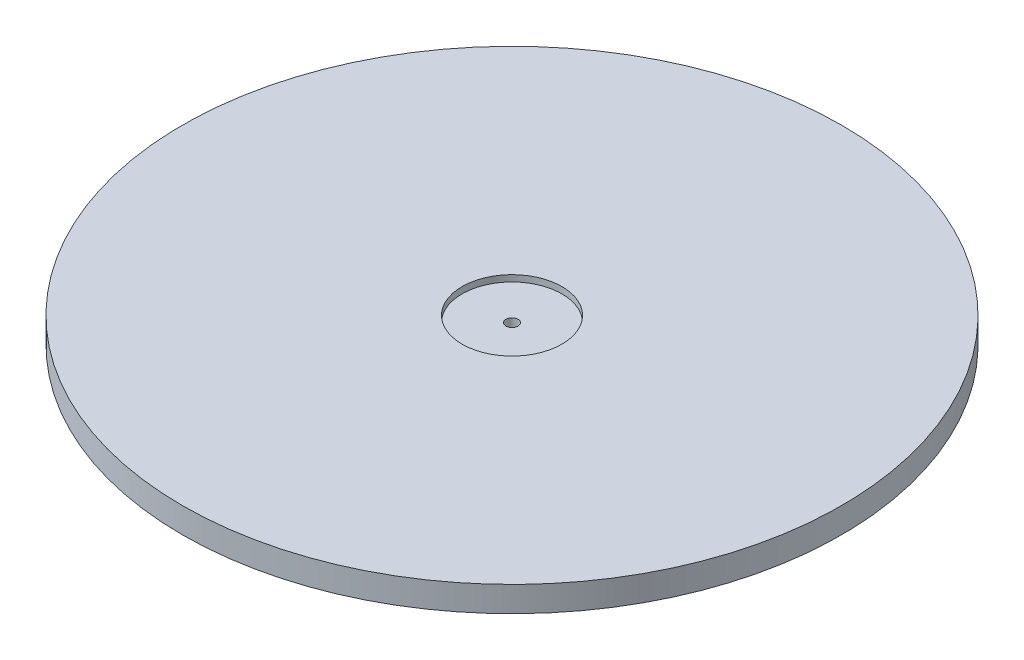
ISO-10303-21;
HEADER;
FILE_DESCRIPTION(('STEP AP214'),'2;1');
FILE_NAME('part.step','',(''),(''),'','','');
FILE_SCHEMA(('AUTOMOTIVE_DESIGN { 1 0 10303 214 1 1 1 1 }'));
ENDSEC;
DATA;
#1=APPLICATION_CONTEXT('core data for automotive mechanical design processes');
#2=APPLICATION_PROTOCOL_DEFINITION('international standard','automotive_design',2000,#1);
#3=PRODUCT_CONTEXT('',#1,'mechanical');
#4=PRODUCT('Part','Part','',(#3));
#5=PRODUCT_RELATED_PRODUCT_CATEGORY('part','',(#4));
#6=PRODUCT_DEFINITION_FORMATION('','',#4);
#7=PRODUCT_DEFINITION_CONTEXT('part definition',#1,'design');
#8=PRODUCT_DEFINITION('design','',#6,#7);
#9=PRODUCT_DEFINITION_SHAPE('','',#8);
#10=(LENGTH_UNIT() NAMED_UNIT(*) SI_UNIT(.MILLI.,.METRE.));
#11=(NAMED_UNIT(*) PLANE_ANGLE_UNIT() SI_UNIT($,.RADIAN.));
#12=(NAMED_UNIT(*) SI_UNIT($,.STERADIAN.) SOLID_ANGLE_UNIT());
#13=UNCERTAINTY_MEASURE_WITH_UNIT(LENGTH_MEASURE(1.E-05),#10,'distance_accuracy_value','');
#14=(GEOMETRIC_REPRESENTATION_CONTEXT(3) GLOBAL_UNCERTAINTY_ASSIGNED_CONTEXT((#13)) GLOBAL_UNIT_ASSIGNED_CONTEXT((#10,
#11,#12)) REPRESENTATION_CONTEXT('',''));
#15=CARTESIAN_POINT('',(0.,0.,0.));
#16=DIRECTION('',(0.,0.,1.));
#17=DIRECTION('',(1.,0.,0.));
#18=AXIS2_PLACEMENT_3D('',#15,#16,#17);
#19=CARTESIAN_POINT('',(0.,12.7,0.));
#20=DIRECTION('',(0.,-1.,0.));
#21=DIRECTION('',(0.,0.,-1.));
#22=AXIS2_PLACEMENT_3D('',#19,#20,#21);
#23=CYLINDRICAL_SURFACE('',#22,3.);
#24=CARTESIAN_POINT('',(0.,9.525,0.));
#25=DIRECTION('',(0.,-1.,0.));
#26=DIRECTION('',(0.,0.,-1.));
#27=AXIS2_PLACEMENT_3D('',#24,#25,#26);
#28=CIRCLE('',#27,3.);
#29=CARTESIAN_POINT('',(0.,9.525,-3.));
#30=VERTEX_POINT('',#29);
#31=EDGE_CURVE('E39',#30,#30,#28,.T.);
#32=ORIENTED_EDGE('',*,*,#31,.T.);
#33=EDGE_LOOP('',(#32));
#34=FACE_BOUND('',#33,.T.);
#35=CARTESIAN_POINT('',(0.,15.875,0.));
#36=DIRECTION('',(0.,-1.,0.));
#37=DIRECTION('',(0.,0.,-1.));
#38=AXIS2_PLACEMENT_3D('',#35,#36,#37);
#39=CIRCLE('',#38,3.);
#40=CARTESIAN_POINT('',(0.,15.875,-3.));
#41=VERTEX_POINT('',#40);
#42=EDGE_CURVE('E61',#41,#41,#39,.T.);
#43=ORIENTED_EDGE('',*,*,#42,.F.);
#44=EDGE_LOOP('',(#43));
#45=FACE_BOUND('',#44,.T.);
#46=ADVANCED_FACE('F35',(#34,#45),#23,.F.);
#47=CARTESIAN_POINT('',(0.,12.7,0.));
#48=DIRECTION('',(0.,-1.,0.));
#49=DIRECTION('',(0.,0.,-1.));
#50=AXIS2_PLACEMENT_3D('',#47,#48,#49);
#51=CYLINDRICAL_SURFACE('',#50,165.1);
#52=CARTESIAN_POINT('',(0.,19.05,0.));
#53=DIRECTION('',(0.,1.,0.));
#54=DIRECTION('',(0.,0.,1.));
#55=AXIS2_PLACEMENT_3D('',#52,#53,#54);
#56=CIRCLE('',#55,165.1);
#57=CARTESIAN_POINT('',(0.,19.05,165.1));
#58=VERTEX_POINT('',#57);
#59=EDGE_CURVE('E10',#58,#58,#56,.T.);
#60=ORIENTED_EDGE('',*,*,#59,.F.);
#61=EDGE_LOOP('',(#60));
#62=FACE_BOUND('',#61,.T.);
#63=CARTESIAN_POINT('',(0.,6.35,0.));
#64=DIRECTION('',(0.,-1.,0.));
#65=DIRECTION('',(0.,0.,-1.));
#66=AXIS2_PLACEMENT_3D('',#63,#64,#65);
#67=CIRCLE('',#66,165.1);
#68=CARTESIAN_POINT('',(0.,6.35,-165.1));
#69=VERTEX_POINT('',#68);
#70=EDGE_CURVE('E47',#69,#69,#67,.T.);
#71=ORIENTED_EDGE('',*,*,#70,.F.);
#72=EDGE_LOOP('',(#71));
#73=FACE_BOUND('',#72,.T.);
#74=ADVANCED_FACE('F37',(#62,#73),#51,.T.);
#75=CARTESIAN_POINT('',(0.,19.05,0.));
#76=DIRECTION('',(0.,1.,0.));
#77=DIRECTION('',(0.,0.,1.));
#78=AXIS2_PLACEMENT_3D('',#75,#76,#77);
#79=PLANE('',#78);
#80=CARTESIAN_POINT('',(0.,19.05,0.));
#81=DIRECTION('',(0.,1.,0.));
#82=DIRECTION('',(0.,0.,1.));
#83=AXIS2_PLACEMENT_3D('',#80,#81,#82);
#84=CIRCLE('',#83,25.);
#85=CARTESIAN_POINT('',(0.,19.05,25.));
#86=VERTEX_POINT('',#85);
#87=EDGE_CURVE('E43',#86,#86,#84,.T.);
#88=ORIENTED_EDGE('',*,*,#87,.F.);
#89=EDGE_LOOP('',(#88));
#90=FACE_BOUND('',#89,.T.);
#91=ORIENTED_EDGE('',*,*,#59,.T.);
#92=EDGE_LOOP('',(#91));
#93=FACE_BOUND('',#92,.T.);
#94=ADVANCED_FACE('F73',(#90,#93),#79,.T.);
#95=CARTESIAN_POINT('',(0.,12.7,0.));
#96=DIRECTION('',(0.,1.,0.));
#97=DIRECTION('',(0.,0.,1.));
#98=AXIS2_PLACEMENT_3D('',#95,#96,#97);
#99=CYLINDRICAL_SURFACE('',#98,25.);
#100=CARTESIAN_POINT('',(0.,15.875,0.));
#101=DIRECTION('',(0.,1.,0.));
#102=DIRECTION('',(0.,0.,1.));
#103=AXIS2_PLACEMENT_3D('',#100,#101,#102);
#104=CIRCLE('',#103,25.);
#105=CARTESIAN_POINT('',(0.,15.875,25.));
#106=VERTEX_POINT('',#105);
#107=EDGE_CURVE('E56',#106,#106,#104,.T.);
#108=ORIENTED_EDGE('',*,*,#107,.F.);
#109=EDGE_LOOP('',(#108));
#110=FACE_BOUND('',#109,.T.);
#111=ORIENTED_EDGE('',*,*,#87,.T.);
#112=EDGE_LOOP('',(#111));
#113=FACE_BOUND('',#112,.T.);
#114=ADVANCED_FACE('F79',(#110,#113),#99,.F.);
#115=CARTESIAN_POINT('',(0.,6.35,0.));
#116=DIRECTION('',(0.,-1.,0.));
#117=DIRECTION('',(0.,0.,-1.));
#118=AXIS2_PLACEMENT_3D('',#115,#116,#117);
#119=PLANE('',#118);
#120=CARTESIAN_POINT('',(0.,6.35,0.));
#121=DIRECTION('',(0.,-1.,0.));
#122=DIRECTION('',(0.,0.,-1.));
#123=AXIS2_PLACEMENT_3D('',#120,#121,#122);
#124=CIRCLE('',#123,25.);
#125=CARTESIAN_POINT('',(0.,6.35,-25.));
#126=VERTEX_POINT('',#125);
#127=EDGE_CURVE('E52',#126,#126,#124,.T.);
#128=ORIENTED_EDGE('',*,*,#127,.F.);
#129=EDGE_LOOP('',(#128));
#130=FACE_BOUND('',#129,.T.);
#131=ORIENTED_EDGE('',*,*,#70,.T.);
#132=EDGE_LOOP('',(#131));
#133=FACE_BOUND('',#132,.T.);
#134=ADVANCED_FACE('F83',(#130,#133),#119,.T.);
#135=CARTESIAN_POINT('',(0.,9.525,0.));
#136=DIRECTION('',(0.,-1.,0.));
#137=DIRECTION('',(0.,0.,-1.));
#138=AXIS2_PLACEMENT_3D('',#135,#136,#137);
#139=CYLINDRICAL_SURFACE('',#138,25.);
#140=CARTESIAN_POINT('',(0.,9.525,0.));
#141=DIRECTION('',(0.,-1.,0.));
#142=DIRECTION('',(0.,0.,-1.));
#143=AXIS2_PLACEMENT_3D('',#140,#141,#142);
#144=CIRCLE('',#143,25.);
#145=CARTESIAN_POINT('',(0.,9.525,-25.));
#146=VERTEX_POINT('',#145);
#147=EDGE_CURVE('E55',#146,#146,#144,.T.);
#148=ORIENTED_EDGE('',*,*,#147,.F.);
#149=EDGE_LOOP('',(#148));
#150=FACE_BOUND('',#149,.T.);
#151=ORIENTED_EDGE('',*,*,#127,.T.);
#152=EDGE_LOOP('',(#151));
#153=FACE_BOUND('',#152,.T.);
#154=ADVANCED_FACE('F87',(#150,#153),#139,.F.);
#155=CARTESIAN_POINT('',(0.,9.525,0.));
#156=DIRECTION('',(0.,-1.,0.));
#157=DIRECTION('',(0.,0.,-1.));
#158=AXIS2_PLACEMENT_3D('',#155,#156,#157);
#159=PLANE('',#158);
#160=ORIENTED_EDGE('',*,*,#31,.F.);
#161=EDGE_LOOP('',(#160));
#162=FACE_BOUND('',#161,.T.);
#163=ORIENTED_EDGE('',*,*,#147,.T.);
#164=EDGE_LOOP('',(#163));
#165=FACE_BOUND('',#164,.T.);
#166=ADVANCED_FACE('F91',(#162,#165),#159,.T.);
#167=CARTESIAN_POINT('',(0.,15.875,0.));
#168=DIRECTION('',(0.,1.,0.));
#169=DIRECTION('',(0.,0.,1.));
#170=AXIS2_PLACEMENT_3D('',#167,#168,#169);
#171=PLANE('',#170);
#172=ORIENTED_EDGE('',*,*,#42,.T.);
#173=EDGE_LOOP('',(#172));
#174=FACE_BOUND('',#173,.T.);
#175=ORIENTED_EDGE('',*,*,#107,.T.);
#176=EDGE_LOOP('',(#175));
#177=FACE_BOUND('',#176,.T.);
#178=ADVANCED_FACE('F65',(#174,#177),#171,.T.);
#179=CLOSED_SHELL('',(#46,#74,#94,#114,#134,#154,#166,#178));
#180=MANIFOLD_SOLID_BREP('B2',#179);
#181=ADVANCED_BREP_SHAPE_REPRESENTATION('',(#18,#180),#14);
#182=SHAPE_DEFINITION_REPRESENTATION(#9,#181);
ENDSEC;
END-ISO-10303-21;
